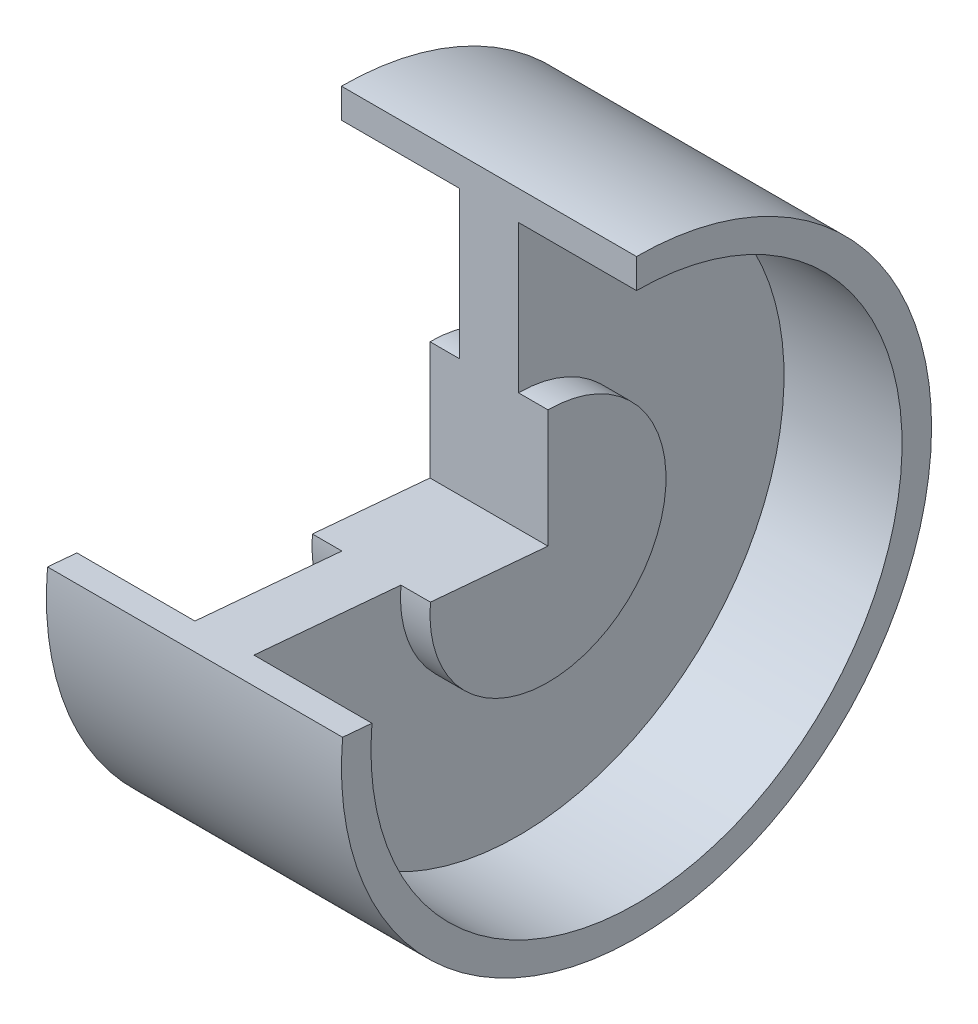
ISO-10303-21;
HEADER;
FILE_DESCRIPTION(('STEP AP214'),'2;1');
FILE_NAME('part.step','',(''),(''),'','','');
FILE_SCHEMA(('AUTOMOTIVE_DESIGN { 1 0 10303 214 1 1 1 1 }'));
ENDSEC;
DATA;
#1=APPLICATION_CONTEXT('core data for automotive mechanical design processes');
#2=APPLICATION_PROTOCOL_DEFINITION('international standard','automotive_design',2000,#1);
#3=PRODUCT_CONTEXT('',#1,'mechanical');
#4=PRODUCT('Part','Part','',(#3));
#5=PRODUCT_RELATED_PRODUCT_CATEGORY('part','',(#4));
#6=PRODUCT_DEFINITION_FORMATION('','',#4);
#7=PRODUCT_DEFINITION_CONTEXT('part definition',#1,'design');
#8=PRODUCT_DEFINITION('design','',#6,#7);
#9=PRODUCT_DEFINITION_SHAPE('','',#8);
#10=(LENGTH_UNIT() NAMED_UNIT(*) SI_UNIT(.MILLI.,.METRE.));
#11=(NAMED_UNIT(*) PLANE_ANGLE_UNIT() SI_UNIT($,.RADIAN.));
#12=(NAMED_UNIT(*) SI_UNIT($,.STERADIAN.) SOLID_ANGLE_UNIT());
#13=UNCERTAINTY_MEASURE_WITH_UNIT(LENGTH_MEASURE(1.E-05),#10,'distance_accuracy_value','');
#14=(GEOMETRIC_REPRESENTATION_CONTEXT(3) GLOBAL_UNCERTAINTY_ASSIGNED_CONTEXT((#13)) GLOBAL_UNIT_ASSIGNED_CONTEXT((#10,
#11,#12)) REPRESENTATION_CONTEXT('',''));
#15=CARTESIAN_POINT('',(0.,0.,0.));
#16=DIRECTION('',(0.,0.,1.));
#17=DIRECTION('',(1.,0.,0.));
#18=AXIS2_PLACEMENT_3D('',#15,#16,#17);
#19=CARTESIAN_POINT('',(10.,0.,0.));
#20=DIRECTION('',(1.,0.,0.));
#21=DIRECTION('',(0.,0.,-1.));
#22=AXIS2_PLACEMENT_3D('',#19,#20,#21);
#23=PLANE('',#22);
#24=CARTESIAN_POINT('',(10.,0.,0.));
#25=DIRECTION('',(1.,0.,0.));
#26=DIRECTION('',(0.,0.,-1.));
#27=AXIS2_PLACEMENT_3D('',#24,#25,#26);
#28=CIRCLE('',#27,20.);
#29=CARTESIAN_POINT('',(10.,1.74311485495337,19.9238939618349));
#30=VERTEX_POINT('',#29);
#31=CARTESIAN_POINT('',(10.,20.,0.));
#32=VERTEX_POINT('',#31);
#33=EDGE_CURVE('E11',#30,#32,#28,.T.);
#34=ORIENTED_EDGE('',*,*,#33,.T.);
#35=DIRECTION('',(0.,1.,0.));
#36=VECTOR('',#35,1.);
#37=CARTESIAN_POINT('',(10.,0.,0.));
#38=LINE('',#37,#36);
#39=CARTESIAN_POINT('',(10.,0.,0.));
#40=VERTEX_POINT('',#39);
#41=EDGE_CURVE('E51',#40,#32,#38,.T.);
#42=ORIENTED_EDGE('',*,*,#41,.F.);
#43=DIRECTION('',(0.,0.0871557427476685,0.996194698091745));
#44=VECTOR('',#43,1.);
#45=CARTESIAN_POINT('',(10.,0.,0.));
#46=LINE('',#45,#44);
#47=EDGE_CURVE('E118',#40,#30,#46,.T.);
#48=ORIENTED_EDGE('',*,*,#47,.T.);
#49=EDGE_LOOP('',(#34,#42,#48));
#50=FACE_BOUND('',#49,.T.);
#51=ADVANCED_FACE('F37',(#50),#23,.T.);
#52=CARTESIAN_POINT('',(0.,0.,0.));
#53=DIRECTION('',(1.,0.,0.));
#54=DIRECTION('',(0.,0.,-1.));
#55=AXIS2_PLACEMENT_3D('',#52,#53,#54);
#56=CYLINDRICAL_SURFACE('',#55,20.);
#57=CARTESIAN_POINT('',(5.,0.,0.));
#58=DIRECTION('',(1.,0.,0.));
#59=DIRECTION('',(0.,0.,-1.));
#60=AXIS2_PLACEMENT_3D('',#57,#58,#59);
#61=CIRCLE('',#60,20.);
#62=CARTESIAN_POINT('',(5.,1.74311485495337,19.9238939618349));
#63=VERTEX_POINT('',#62);
#64=CARTESIAN_POINT('',(5.,20.,0.));
#65=VERTEX_POINT('',#64);
#66=EDGE_CURVE('E45',#63,#65,#61,.T.);
#67=ORIENTED_EDGE('',*,*,#66,.T.);
#68=DIRECTION('',(-1.,0.,0.));
#69=VECTOR('',#68,1.);
#70=CARTESIAN_POINT('',(10.,20.,0.));
#71=LINE('',#70,#69);
#72=EDGE_CURVE('E127',#32,#65,#71,.T.);
#73=ORIENTED_EDGE('',*,*,#72,.F.);
#74=ORIENTED_EDGE('',*,*,#33,.F.);
#75=DIRECTION('',(-1.,0.,0.));
#76=VECTOR('',#75,1.);
#77=CARTESIAN_POINT('',(10.,1.74311485495337,19.9238939618349));
#78=LINE('',#77,#76);
#79=EDGE_CURVE('E158',#30,#63,#78,.T.);
#80=ORIENTED_EDGE('',*,*,#79,.T.);
#81=EDGE_LOOP('',(#67,#73,#74,#80));
#82=FACE_BOUND('',#81,.T.);
#83=ADVANCED_FACE('F39',(#82),#56,.T.);
#84=CARTESIAN_POINT('',(5.,1.74311485495337,19.9238939618349));
#85=DIRECTION('',(1.,0.,0.));
#86=DIRECTION('',(0.,0.,-1.));
#87=AXIS2_PLACEMENT_3D('',#84,#85,#86);
#88=PLANE('',#87);
#89=CARTESIAN_POINT('',(5.,0.,0.));
#90=DIRECTION('',(1.,0.,0.));
#91=DIRECTION('',(0.,0.,-1.));
#92=AXIS2_PLACEMENT_3D('',#89,#90,#91);
#93=CIRCLE('',#92,45.);
#94=CARTESIAN_POINT('',(5.,3.92200842364508,44.8287614141285));
#95=VERTEX_POINT('',#94);
#96=CARTESIAN_POINT('',(5.,45.,0.));
#97=VERTEX_POINT('',#96);
#98=EDGE_CURVE('E202',#95,#97,#93,.T.);
#99=ORIENTED_EDGE('',*,*,#98,.T.);
#100=DIRECTION('',(0.,1.,0.));
#101=VECTOR('',#100,1.);
#102=CARTESIAN_POINT('',(5.,20.,0.));
#103=LINE('',#102,#101);
#104=EDGE_CURVE('E130',#65,#97,#103,.T.);
#105=ORIENTED_EDGE('',*,*,#104,.F.);
#106=ORIENTED_EDGE('',*,*,#66,.F.);
#107=DIRECTION('',(0.,0.0871557427476685,0.996194698091745));
#108=VECTOR('',#107,1.);
#109=CARTESIAN_POINT('',(5.,1.74311485495337,19.9238939618349));
#110=LINE('',#109,#108);
#111=EDGE_CURVE('E160',#63,#95,#110,.T.);
#112=ORIENTED_EDGE('',*,*,#111,.T.);
#113=EDGE_LOOP('',(#99,#105,#106,#112));
#114=FACE_BOUND('',#113,.T.);
#115=ADVANCED_FACE('F204',(#114),#88,.T.);
#116=CARTESIAN_POINT('',(0.,0.,0.));
#117=DIRECTION('',(1.,0.,0.));
#118=DIRECTION('',(0.,0.,-1.));
#119=AXIS2_PLACEMENT_3D('',#116,#117,#118);
#120=CYLINDRICAL_SURFACE('',#119,45.);
#121=CARTESIAN_POINT('',(25.,0.,0.));
#122=DIRECTION('',(1.,0.,0.));
#123=DIRECTION('',(0.,0.,-1.));
#124=AXIS2_PLACEMENT_3D('',#121,#122,#123);
#125=CIRCLE('',#124,45.);
#126=CARTESIAN_POINT('',(25.,3.92200842364508,44.8287614141285));
#127=VERTEX_POINT('',#126);
#128=CARTESIAN_POINT('',(25.,45.,0.));
#129=VERTEX_POINT('',#128);
#130=EDGE_CURVE('E200',#127,#129,#125,.T.);
#131=ORIENTED_EDGE('',*,*,#130,.T.);
#132=DIRECTION('',(1.,0.,0.));
#133=VECTOR('',#132,1.);
#134=CARTESIAN_POINT('',(5.,45.,0.));
#135=LINE('',#134,#133);
#136=EDGE_CURVE('E132',#97,#129,#135,.T.);
#137=ORIENTED_EDGE('',*,*,#136,.F.);
#138=ORIENTED_EDGE('',*,*,#98,.F.);
#139=DIRECTION('',(1.,0.,0.));
#140=VECTOR('',#139,1.);
#141=CARTESIAN_POINT('',(5.,3.92200842364508,44.8287614141285));
#142=LINE('',#141,#140);
#143=EDGE_CURVE('E163',#95,#127,#142,.T.);
#144=ORIENTED_EDGE('',*,*,#143,.T.);
#145=EDGE_LOOP('',(#131,#137,#138,#144));
#146=FACE_BOUND('',#145,.T.);
#147=ADVANCED_FACE('F210',(#146),#120,.F.);
#148=CARTESIAN_POINT('',(25.,3.92200842364508,44.8287614141285));
#149=DIRECTION('',(1.,0.,0.));
#150=DIRECTION('',(0.,0.,-1.));
#151=AXIS2_PLACEMENT_3D('',#148,#149,#150);
#152=PLANE('',#151);
#153=CARTESIAN_POINT('',(25.,0.,0.));
#154=DIRECTION('',(1.,0.,0.));
#155=DIRECTION('',(0.,0.,-1.));
#156=AXIS2_PLACEMENT_3D('',#153,#154,#155);
#157=CIRCLE('',#156,50.);
#158=CARTESIAN_POINT('',(25.,4.35778713738342,49.8097349045872));
#159=VERTEX_POINT('',#158);
#160=CARTESIAN_POINT('',(25.,50.,0.));
#161=VERTEX_POINT('',#160);
#162=EDGE_CURVE('E198',#159,#161,#157,.T.);
#163=ORIENTED_EDGE('',*,*,#162,.T.);
#164=DIRECTION('',(0.,1.,0.));
#165=VECTOR('',#164,1.);
#166=CARTESIAN_POINT('',(25.,45.,0.));
#167=LINE('',#166,#165);
#168=EDGE_CURVE('E137',#129,#161,#167,.T.);
#169=ORIENTED_EDGE('',*,*,#168,.F.);
#170=ORIENTED_EDGE('',*,*,#130,.F.);
#171=DIRECTION('',(0.,0.0871557427476685,0.996194698091745));
#172=VECTOR('',#171,1.);
#173=CARTESIAN_POINT('',(25.,3.92200842364508,44.8287614141285));
#174=LINE('',#173,#172);
#175=EDGE_CURVE('E166',#127,#159,#174,.T.);
#176=ORIENTED_EDGE('',*,*,#175,.T.);
#177=EDGE_LOOP('',(#163,#169,#170,#176));
#178=FACE_BOUND('',#177,.T.);
#179=ADVANCED_FACE('F213',(#178),#152,.T.);
#180=CARTESIAN_POINT('',(0.,0.,0.));
#181=DIRECTION('',(1.,0.,0.));
#182=DIRECTION('',(0.,0.,-1.));
#183=AXIS2_PLACEMENT_3D('',#180,#181,#182);
#184=CYLINDRICAL_SURFACE('',#183,50.);
#185=CARTESIAN_POINT('',(-25.,0.,0.));
#186=DIRECTION('',(1.,0.,0.));
#187=DIRECTION('',(0.,0.,-1.));
#188=AXIS2_PLACEMENT_3D('',#185,#186,#187);
#189=CIRCLE('',#188,50.);
#190=CARTESIAN_POINT('',(-25.,4.35778713738342,49.8097349045872));
#191=VERTEX_POINT('',#190);
#192=CARTESIAN_POINT('',(-25.,50.,0.));
#193=VERTEX_POINT('',#192);
#194=EDGE_CURVE('E196',#191,#193,#189,.T.);
#195=ORIENTED_EDGE('',*,*,#194,.T.);
#196=DIRECTION('',(-1.,0.,0.));
#197=VECTOR('',#196,1.);
#198=CARTESIAN_POINT('',(25.,50.,0.));
#199=LINE('',#198,#197);
#200=EDGE_CURVE('E140',#161,#193,#199,.T.);
#201=ORIENTED_EDGE('',*,*,#200,.F.);
#202=ORIENTED_EDGE('',*,*,#162,.F.);
#203=DIRECTION('',(-1.,0.,0.));
#204=VECTOR('',#203,1.);
#205=CARTESIAN_POINT('',(25.,4.35778713738342,49.8097349045872));
#206=LINE('',#205,#204);
#207=EDGE_CURVE('E169',#159,#191,#206,.T.);
#208=ORIENTED_EDGE('',*,*,#207,.T.);
#209=EDGE_LOOP('',(#195,#201,#202,#208));
#210=FACE_BOUND('',#209,.T.);
#211=ADVANCED_FACE('F218',(#210),#184,.T.);
#212=CARTESIAN_POINT('',(-25.,3.92200842364508,44.8287614141285));
#213=DIRECTION('',(-1.,0.,0.));
#214=DIRECTION('',(0.,0.,1.));
#215=AXIS2_PLACEMENT_3D('',#212,#213,#214);
#216=PLANE('',#215);
#217=CARTESIAN_POINT('',(-25.,0.,0.));
#218=DIRECTION('',(1.,0.,0.));
#219=DIRECTION('',(0.,0.,-1.));
#220=AXIS2_PLACEMENT_3D('',#217,#218,#219);
#221=CIRCLE('',#220,45.);
#222=CARTESIAN_POINT('',(-25.,3.92200842364508,44.8287614141285));
#223=VERTEX_POINT('',#222);
#224=CARTESIAN_POINT('',(-25.,45.,0.));
#225=VERTEX_POINT('',#224);
#226=EDGE_CURVE('E194',#223,#225,#221,.T.);
#227=ORIENTED_EDGE('',*,*,#226,.T.);
#228=DIRECTION('',(0.,-1.,0.));
#229=VECTOR('',#228,1.);
#230=CARTESIAN_POINT('',(-25.,45.,0.));
#231=LINE('',#230,#229);
#232=EDGE_CURVE('E143',#193,#225,#231,.T.);
#233=ORIENTED_EDGE('',*,*,#232,.F.);
#234=ORIENTED_EDGE('',*,*,#194,.F.);
#235=DIRECTION('',(0.,-0.0871557427476685,-0.996194698091745));
#236=VECTOR('',#235,1.);
#237=CARTESIAN_POINT('',(-25.,3.92200842364508,44.8287614141285));
#238=LINE('',#237,#236);
#239=EDGE_CURVE('E172',#191,#223,#238,.T.);
#240=ORIENTED_EDGE('',*,*,#239,.T.);
#241=EDGE_LOOP('',(#227,#233,#234,#240));
#242=FACE_BOUND('',#241,.T.);
#243=ADVANCED_FACE('F221',(#242),#216,.T.);
#244=CARTESIAN_POINT('',(0.,0.,0.));
#245=DIRECTION('',(1.,0.,0.));
#246=DIRECTION('',(0.,0.,-1.));
#247=AXIS2_PLACEMENT_3D('',#244,#245,#246);
#248=CYLINDRICAL_SURFACE('',#247,45.);
#249=CARTESIAN_POINT('',(-5.,0.,0.));
#250=DIRECTION('',(1.,0.,0.));
#251=DIRECTION('',(0.,0.,-1.));
#252=AXIS2_PLACEMENT_3D('',#249,#250,#251);
#253=CIRCLE('',#252,45.);
#254=CARTESIAN_POINT('',(-5.,3.92200842364508,44.8287614141285));
#255=VERTEX_POINT('',#254);
#256=CARTESIAN_POINT('',(-5.,45.,0.));
#257=VERTEX_POINT('',#256);
#258=EDGE_CURVE('E192',#255,#257,#253,.T.);
#259=ORIENTED_EDGE('',*,*,#258,.T.);
#260=DIRECTION('',(1.,0.,0.));
#261=VECTOR('',#260,1.);
#262=CARTESIAN_POINT('',(-5.,45.,0.));
#263=LINE('',#262,#261);
#264=EDGE_CURVE('E146',#225,#257,#263,.T.);
#265=ORIENTED_EDGE('',*,*,#264,.F.);
#266=ORIENTED_EDGE('',*,*,#226,.F.);
#267=DIRECTION('',(1.,0.,0.));
#268=VECTOR('',#267,1.);
#269=CARTESIAN_POINT('',(-5.,3.92200842364508,44.8287614141285));
#270=LINE('',#269,#268);
#271=EDGE_CURVE('E175',#223,#255,#270,.T.);
#272=ORIENTED_EDGE('',*,*,#271,.T.);
#273=EDGE_LOOP('',(#259,#265,#266,#272));
#274=FACE_BOUND('',#273,.T.);
#275=ADVANCED_FACE('F226',(#274),#248,.F.);
#276=CARTESIAN_POINT('',(-5.,1.74311485495337,19.9238939618349));
#277=DIRECTION('',(-1.,0.,0.));
#278=DIRECTION('',(0.,0.,1.));
#279=AXIS2_PLACEMENT_3D('',#276,#277,#278);
#280=PLANE('',#279);
#281=CARTESIAN_POINT('',(-5.,0.,0.));
#282=DIRECTION('',(1.,0.,0.));
#283=DIRECTION('',(0.,0.,-1.));
#284=AXIS2_PLACEMENT_3D('',#281,#282,#283);
#285=CIRCLE('',#284,20.);
#286=CARTESIAN_POINT('',(-5.,1.74311485495337,19.9238939618349));
#287=VERTEX_POINT('',#286);
#288=CARTESIAN_POINT('',(-5.,20.,0.));
#289=VERTEX_POINT('',#288);
#290=EDGE_CURVE('E190',#287,#289,#285,.T.);
#291=ORIENTED_EDGE('',*,*,#290,.T.);
#292=DIRECTION('',(0.,-1.,0.));
#293=VECTOR('',#292,1.);
#294=CARTESIAN_POINT('',(-5.,20.,0.));
#295=LINE('',#294,#293);
#296=EDGE_CURVE('E149',#257,#289,#295,.T.);
#297=ORIENTED_EDGE('',*,*,#296,.F.);
#298=ORIENTED_EDGE('',*,*,#258,.F.);
#299=DIRECTION('',(0.,-0.0871557427476685,-0.996194698091745));
#300=VECTOR('',#299,1.);
#301=CARTESIAN_POINT('',(-5.,1.74311485495337,19.9238939618349));
#302=LINE('',#301,#300);
#303=EDGE_CURVE('E178',#255,#287,#302,.T.);
#304=ORIENTED_EDGE('',*,*,#303,.T.);
#305=EDGE_LOOP('',(#291,#297,#298,#304));
#306=FACE_BOUND('',#305,.T.);
#307=ADVANCED_FACE('F229',(#306),#280,.T.);
#308=CARTESIAN_POINT('',(0.,0.,0.));
#309=DIRECTION('',(1.,0.,0.));
#310=DIRECTION('',(0.,0.,-1.));
#311=AXIS2_PLACEMENT_3D('',#308,#309,#310);
#312=CYLINDRICAL_SURFACE('',#311,20.);
#313=CARTESIAN_POINT('',(-10.,0.,0.));
#314=DIRECTION('',(1.,0.,0.));
#315=DIRECTION('',(0.,0.,-1.));
#316=AXIS2_PLACEMENT_3D('',#313,#314,#315);
#317=CIRCLE('',#316,20.);
#318=CARTESIAN_POINT('',(-10.,1.74311485495337,19.9238939618349));
#319=VERTEX_POINT('',#318);
#320=CARTESIAN_POINT('',(-10.,20.,0.));
#321=VERTEX_POINT('',#320);
#322=EDGE_CURVE('E188',#319,#321,#317,.T.);
#323=ORIENTED_EDGE('',*,*,#322,.T.);
#324=DIRECTION('',(-1.,0.,0.));
#325=VECTOR('',#324,1.);
#326=CARTESIAN_POINT('',(-10.,20.,0.));
#327=LINE('',#326,#325);
#328=EDGE_CURVE('E152',#289,#321,#327,.T.);
#329=ORIENTED_EDGE('',*,*,#328,.F.);
#330=ORIENTED_EDGE('',*,*,#290,.F.);
#331=DIRECTION('',(-1.,0.,0.));
#332=VECTOR('',#331,1.);
#333=CARTESIAN_POINT('',(-10.,1.74311485495337,19.9238939618349));
#334=LINE('',#333,#332);
#335=EDGE_CURVE('E181',#287,#319,#334,.T.);
#336=ORIENTED_EDGE('',*,*,#335,.T.);
#337=EDGE_LOOP('',(#323,#329,#330,#336));
#338=FACE_BOUND('',#337,.T.);
#339=ADVANCED_FACE('F234',(#338),#312,.T.);
#340=CARTESIAN_POINT('',(-10.,0.,0.));
#341=DIRECTION('',(-1.,0.,0.));
#342=DIRECTION('',(0.,0.,1.));
#343=AXIS2_PLACEMENT_3D('',#340,#341,#342);
#344=PLANE('',#343);
#345=DIRECTION('',(0.,-1.,0.));
#346=VECTOR('',#345,1.);
#347=CARTESIAN_POINT('',(-10.,0.,0.));
#348=LINE('',#347,#346);
#349=CARTESIAN_POINT('',(-10.,0.,0.));
#350=VERTEX_POINT('',#349);
#351=EDGE_CURVE('E155',#321,#350,#348,.T.);
#352=ORIENTED_EDGE('',*,*,#351,.F.);
#353=ORIENTED_EDGE('',*,*,#322,.F.);
#354=DIRECTION('',(0.,-0.0871557427476685,-0.996194698091745));
#355=VECTOR('',#354,1.);
#356=CARTESIAN_POINT('',(-10.,0.,0.));
#357=LINE('',#356,#355);
#358=EDGE_CURVE('E184',#319,#350,#357,.T.);
#359=ORIENTED_EDGE('',*,*,#358,.T.);
#360=EDGE_LOOP('',(#352,#353,#359));
#361=FACE_BOUND('',#360,.T.);
#362=ADVANCED_FACE('F236',(#361),#344,.T.);
#363=CARTESIAN_POINT('',(0.,0.,0.));
#364=DIRECTION('',(0.,-0.996194698091745,0.0871557427476685));
#365=DIRECTION('',(1.,0.,0.));
#366=AXIS2_PLACEMENT_3D('',#363,#364,#365);
#367=PLANE('',#366);
#368=ORIENTED_EDGE('',*,*,#47,.F.);
#369=DIRECTION('',(1.,0.,0.));
#370=VECTOR('',#369,1.);
#371=CARTESIAN_POINT('',(-10.,0.,0.));
#372=LINE('',#371,#370);
#373=EDGE_CURVE('E58',#350,#40,#372,.T.);
#374=ORIENTED_EDGE('',*,*,#373,.F.);
#375=ORIENTED_EDGE('',*,*,#358,.F.);
#376=ORIENTED_EDGE('',*,*,#335,.F.);
#377=ORIENTED_EDGE('',*,*,#303,.F.);
#378=ORIENTED_EDGE('',*,*,#271,.F.);
#379=ORIENTED_EDGE('',*,*,#239,.F.);
#380=ORIENTED_EDGE('',*,*,#207,.F.);
#381=ORIENTED_EDGE('',*,*,#175,.F.);
#382=ORIENTED_EDGE('',*,*,#143,.F.);
#383=ORIENTED_EDGE('',*,*,#111,.F.);
#384=ORIENTED_EDGE('',*,*,#79,.F.);
#385=EDGE_LOOP('',(#368,#374,#375,#376,#377,#378,#379,#380,#381,#382,#383,#384));
#386=FACE_BOUND('',#385,.T.);
#387=ADVANCED_FACE('F237',(#386),#367,.F.);
#388=CARTESIAN_POINT('',(0.,0.,0.));
#389=DIRECTION('',(0.,0.,1.));
#390=DIRECTION('',(1.,0.,0.));
#391=AXIS2_PLACEMENT_3D('',#388,#389,#390);
#392=PLANE('',#391);
#393=ORIENTED_EDGE('',*,*,#41,.T.);
#394=ORIENTED_EDGE('',*,*,#72,.T.);
#395=ORIENTED_EDGE('',*,*,#104,.T.);
#396=ORIENTED_EDGE('',*,*,#136,.T.);
#397=ORIENTED_EDGE('',*,*,#168,.T.);
#398=ORIENTED_EDGE('',*,*,#200,.T.);
#399=ORIENTED_EDGE('',*,*,#232,.T.);
#400=ORIENTED_EDGE('',*,*,#264,.T.);
#401=ORIENTED_EDGE('',*,*,#296,.T.);
#402=ORIENTED_EDGE('',*,*,#328,.T.);
#403=ORIENTED_EDGE('',*,*,#351,.T.);
#404=ORIENTED_EDGE('',*,*,#373,.T.);
#405=EDGE_LOOP('',(#393,#394,#395,#396,#397,#398,#399,#400,#401,#402,#403,#404));
#406=FACE_BOUND('',#405,.T.);
#407=ADVANCED_FACE('F125',(#406),#392,.T.);
#408=CLOSED_SHELL('',(#51,#83,#115,#147,#179,#211,#243,#275,#307,#339,#362,#387,#407));
#409=MANIFOLD_SOLID_BREP('B2',#408);
#410=ADVANCED_BREP_SHAPE_REPRESENTATION('',(#18,#409),#14);
#411=SHAPE_DEFINITION_REPRESENTATION(#9,#410);
ENDSEC;
END-ISO-10303-21;
